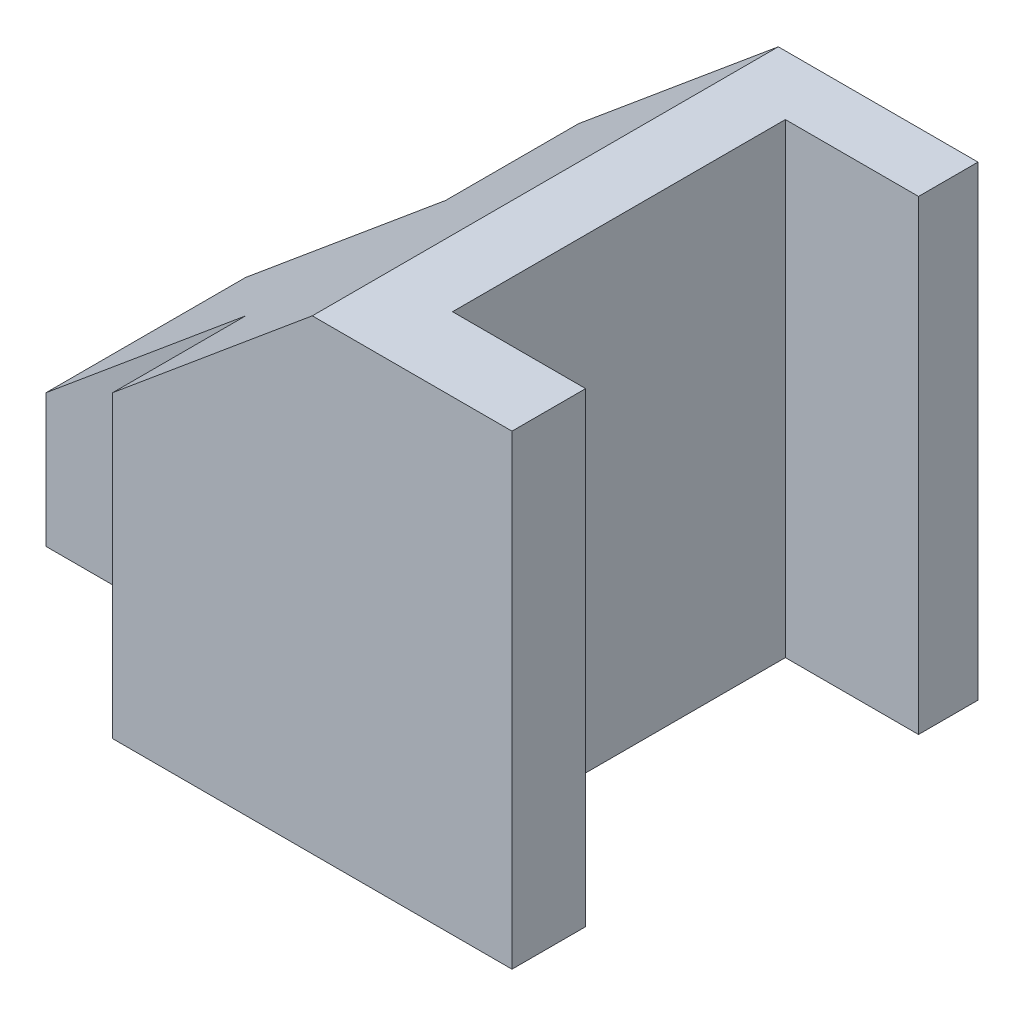
ISO-10303-21;
HEADER;
FILE_DESCRIPTION(('STEP AP214'),'2;1');
FILE_NAME('part.step','',(''),(''),'','','');
FILE_SCHEMA(('AUTOMOTIVE_DESIGN { 1 0 10303 214 1 1 1 1 }'));
ENDSEC;
DATA;
#1=APPLICATION_CONTEXT('core data for automotive mechanical design processes');
#2=APPLICATION_PROTOCOL_DEFINITION('international standard','automotive_design',2000,#1);
#3=PRODUCT_CONTEXT('',#1,'mechanical');
#4=PRODUCT('Part','Part','',(#3));
#5=PRODUCT_RELATED_PRODUCT_CATEGORY('part','',(#4));
#6=PRODUCT_DEFINITION_FORMATION('','',#4);
#7=PRODUCT_DEFINITION_CONTEXT('part definition',#1,'design');
#8=PRODUCT_DEFINITION('design','',#6,#7);
#9=PRODUCT_DEFINITION_SHAPE('','',#8);
#10=(LENGTH_UNIT() NAMED_UNIT(*) SI_UNIT(.MILLI.,.METRE.));
#11=(NAMED_UNIT(*) PLANE_ANGLE_UNIT() SI_UNIT($,.RADIAN.));
#12=(NAMED_UNIT(*) SI_UNIT($,.STERADIAN.) SOLID_ANGLE_UNIT());
#13=UNCERTAINTY_MEASURE_WITH_UNIT(LENGTH_MEASURE(1.E-05),#10,'distance_accuracy_value','');
#14=(GEOMETRIC_REPRESENTATION_CONTEXT(3) GLOBAL_UNCERTAINTY_ASSIGNED_CONTEXT((#13)) GLOBAL_UNIT_ASSIGNED_CONTEXT((#10,
#11,#12)) REPRESENTATION_CONTEXT('',''));
#15=CARTESIAN_POINT('',(0.,0.,0.));
#16=DIRECTION('',(0.,0.,1.));
#17=DIRECTION('',(1.,0.,0.));
#18=AXIS2_PLACEMENT_3D('',#15,#16,#17);
#19=CARTESIAN_POINT('',(0.,10000.,35000.));
#20=DIRECTION('',(1.,0.,0.));
#21=DIRECTION('',(0.,0.,-1.));
#22=AXIS2_PLACEMENT_3D('',#19,#20,#21);
#23=PLANE('',#22);
#24=DIRECTION('',(0.,1.,0.));
#25=VECTOR('',#24,1.);
#26=CARTESIAN_POINT('',(0.,0.,10000.));
#27=LINE('',#26,#25);
#28=CARTESIAN_POINT('',(0.,0.,10000.));
#29=VERTEX_POINT('',#28);
#30=CARTESIAN_POINT('',(0.,10000.,10000.));
#31=VERTEX_POINT('',#30);
#32=EDGE_CURVE('E131',#29,#31,#27,.T.);
#33=ORIENTED_EDGE('',*,*,#32,.F.);
#34=DIRECTION('',(0.,0.,-1.));
#35=VECTOR('',#34,1.);
#36=CARTESIAN_POINT('',(0.,0.,35000.));
#37=LINE('',#36,#35);
#38=CARTESIAN_POINT('',(0.,0.,25000.));
#39=VERTEX_POINT('',#38);
#40=EDGE_CURVE('E11',#39,#29,#37,.T.);
#41=ORIENTED_EDGE('',*,*,#40,.F.);
#42=DIRECTION('',(0.,-1.,0.));
#43=VECTOR('',#42,1.);
#44=CARTESIAN_POINT('',(0.,10000.,25000.));
#45=LINE('',#44,#43);
#46=CARTESIAN_POINT('',(0.,10000.,25000.));
#47=VERTEX_POINT('',#46);
#48=EDGE_CURVE('E154',#47,#39,#45,.T.);
#49=ORIENTED_EDGE('',*,*,#48,.F.);
#50=DIRECTION('',(0.,0.,-1.));
#51=VECTOR('',#50,1.);
#52=CARTESIAN_POINT('',(0.,10000.,35000.));
#53=LINE('',#52,#51);
#54=EDGE_CURVE('E143',#47,#31,#53,.T.);
#55=ORIENTED_EDGE('',*,*,#54,.T.);
#56=EDGE_LOOP('',(#33,#41,#49,#55));
#57=FACE_BOUND('',#56,.T.);
#58=ADVANCED_FACE('F33',(#57),#23,.F.);
#59=CARTESIAN_POINT('',(45000.,0.,35000.));
#60=DIRECTION('',(-1.,0.,0.));
#61=DIRECTION('',(0.,0.,1.));
#62=AXIS2_PLACEMENT_3D('',#59,#60,#61);
#63=PLANE('',#62);
#64=DIRECTION('',(0.,0.,-1.));
#65=VECTOR('',#64,1.);
#66=CARTESIAN_POINT('',(45000.,0.,35000.));
#67=LINE('',#66,#65);
#68=CARTESIAN_POINT('',(45000.,0.,35000.));
#69=VERTEX_POINT('',#68);
#70=CARTESIAN_POINT('',(45000.,0.,29467.0152855992));
#71=VERTEX_POINT('',#70);
#72=EDGE_CURVE('E40',#69,#71,#67,.T.);
#73=ORIENTED_EDGE('',*,*,#72,.T.);
#74=DIRECTION('',(0.,1.,0.));
#75=VECTOR('',#74,1.);
#76=CARTESIAN_POINT('',(45000.,0.,29467.0152855992));
#77=LINE('',#76,#75);
#78=CARTESIAN_POINT('',(45000.,35000.,29467.0152855992));
#79=VERTEX_POINT('',#78);
#80=EDGE_CURVE('E187',#71,#79,#77,.T.);
#81=ORIENTED_EDGE('',*,*,#80,.T.);
#82=DIRECTION('',(0.,0.,-1.));
#83=VECTOR('',#82,1.);
#84=CARTESIAN_POINT('',(45000.,35000.,35000.));
#85=LINE('',#84,#83);
#86=CARTESIAN_POINT('',(45000.,35000.,35000.));
#87=VERTEX_POINT('',#86);
#88=EDGE_CURVE('E219',#87,#79,#85,.T.);
#89=ORIENTED_EDGE('',*,*,#88,.F.);
#90=DIRECTION('',(0.,1.,0.));
#91=VECTOR('',#90,1.);
#92=CARTESIAN_POINT('',(45000.,0.,35000.));
#93=LINE('',#92,#91);
#94=EDGE_CURVE('E198',#69,#87,#93,.T.);
#95=ORIENTED_EDGE('',*,*,#94,.F.);
#96=EDGE_LOOP('',(#73,#81,#89,#95));
#97=FACE_BOUND('',#96,.T.);
#98=ADVANCED_FACE('F252',(#97),#63,.F.);
#99=CARTESIAN_POINT('',(0.,0.,35000.));
#100=DIRECTION('',(0.,1.,0.));
#101=DIRECTION('',(0.,0.,1.));
#102=AXIS2_PLACEMENT_3D('',#99,#100,#101);
#103=PLANE('',#102);
#104=DIRECTION('',(-1.,0.,0.));
#105=VECTOR('',#104,1.);
#106=CARTESIAN_POINT('',(15000.,0.,10000.));
#107=LINE('',#106,#105);
#108=CARTESIAN_POINT('',(15000.,0.,10000.));
#109=VERTEX_POINT('',#108);
#110=EDGE_CURVE('E128',#109,#29,#107,.T.);
#111=ORIENTED_EDGE('',*,*,#110,.F.);
#112=DIRECTION('',(0.,0.,-1.));
#113=VECTOR('',#112,1.);
#114=CARTESIAN_POINT('',(15000.,0.,10000.));
#115=LINE('',#114,#113);
#116=CARTESIAN_POINT('',(15000.,0.,0.));
#117=VERTEX_POINT('',#116);
#118=EDGE_CURVE('E164',#109,#117,#115,.T.);
#119=ORIENTED_EDGE('',*,*,#118,.T.);
#120=DIRECTION('',(1.,0.,0.));
#121=VECTOR('',#120,1.);
#122=CARTESIAN_POINT('',(0.,0.,0.));
#123=LINE('',#122,#121);
#124=CARTESIAN_POINT('',(45000.,0.,0.));
#125=VERTEX_POINT('',#124);
#126=EDGE_CURVE('E190',#117,#125,#123,.T.);
#127=ORIENTED_EDGE('',*,*,#126,.T.);
#128=CARTESIAN_POINT('',(45000.,0.,4467.01528559923));
#129=VERTEX_POINT('',#128);
#130=EDGE_CURVE('E221',#129,#125,#67,.T.);
#131=ORIENTED_EDGE('',*,*,#130,.F.);
#132=DIRECTION('',(-1.,0.,0.));
#133=VECTOR('',#132,1.);
#134=CARTESIAN_POINT('',(45000.,0.,4467.01528559923));
#135=LINE('',#134,#133);
#136=CARTESIAN_POINT('',(35000.,0.,4467.01528559924));
#137=VERTEX_POINT('',#136);
#138=EDGE_CURVE('E170',#129,#137,#135,.T.);
#139=ORIENTED_EDGE('',*,*,#138,.T.);
#140=DIRECTION('',(0.,0.,1.));
#141=VECTOR('',#140,1.);
#142=CARTESIAN_POINT('',(35000.,0.,4467.01528559924));
#143=LINE('',#142,#141);
#144=CARTESIAN_POINT('',(35000.,0.,29467.0152855992));
#145=VERTEX_POINT('',#144);
#146=EDGE_CURVE('E173',#137,#145,#143,.T.);
#147=ORIENTED_EDGE('',*,*,#146,.T.);
#148=DIRECTION('',(1.,0.,0.));
#149=VECTOR('',#148,1.);
#150=CARTESIAN_POINT('',(45000.,0.,29467.0152855992));
#151=LINE('',#150,#149);
#152=EDGE_CURVE('E177',#145,#71,#151,.T.);
#153=ORIENTED_EDGE('',*,*,#152,.T.);
#154=ORIENTED_EDGE('',*,*,#72,.F.);
#155=DIRECTION('',(1.,0.,0.));
#156=VECTOR('',#155,1.);
#157=CARTESIAN_POINT('',(0.,0.,35000.));
#158=LINE('',#157,#156);
#159=CARTESIAN_POINT('',(15000.,0.,35000.));
#160=VERTEX_POINT('',#159);
#161=EDGE_CURVE('E196',#160,#69,#158,.T.);
#162=ORIENTED_EDGE('',*,*,#161,.F.);
#163=DIRECTION('',(0.,0.,1.));
#164=VECTOR('',#163,1.);
#165=CARTESIAN_POINT('',(15000.,0.,25000.));
#166=LINE('',#165,#164);
#167=CARTESIAN_POINT('',(15000.,0.,25000.));
#168=VERTEX_POINT('',#167);
#169=EDGE_CURVE('E55',#168,#160,#166,.T.);
#170=ORIENTED_EDGE('',*,*,#169,.F.);
#171=DIRECTION('',(1.,0.,0.));
#172=VECTOR('',#171,1.);
#173=CARTESIAN_POINT('',(0.,0.,25000.));
#174=LINE('',#173,#172);
#175=EDGE_CURVE('E149',#39,#168,#174,.T.);
#176=ORIENTED_EDGE('',*,*,#175,.F.);
#177=ORIENTED_EDGE('',*,*,#40,.T.);
#178=EDGE_LOOP('',(#111,#119,#127,#131,#139,#147,#153,#154,#162,#170,#176,#177));
#179=FACE_BOUND('',#178,.T.);
#180=ADVANCED_FACE('F147',(#179),#103,.F.);
#181=CARTESIAN_POINT('',(45000.,35000.,4467.01528559923));
#182=VERTEX_POINT('',#181);
#183=CARTESIAN_POINT('',(45000.,35000.,0.));
#184=VERTEX_POINT('',#183);
#185=EDGE_CURVE('E218',#182,#184,#85,.T.);
#186=ORIENTED_EDGE('',*,*,#185,.F.);
#187=DIRECTION('',(0.,1.,0.));
#188=VECTOR('',#187,1.);
#189=CARTESIAN_POINT('',(45000.,0.,4467.01528559923));
#190=LINE('',#189,#188);
#191=EDGE_CURVE('E180',#129,#182,#190,.T.);
#192=ORIENTED_EDGE('',*,*,#191,.F.);
#193=ORIENTED_EDGE('',*,*,#130,.T.);
#194=DIRECTION('',(0.,1.,0.));
#195=VECTOR('',#194,1.);
#196=CARTESIAN_POINT('',(45000.,0.,0.));
#197=LINE('',#196,#195);
#198=EDGE_CURVE('E207',#125,#184,#197,.T.);
#199=ORIENTED_EDGE('',*,*,#198,.T.);
#200=EDGE_LOOP('',(#186,#192,#193,#199));
#201=FACE_BOUND('',#200,.T.);
#202=ADVANCED_FACE('F232',(#201),#63,.F.);
#203=CARTESIAN_POINT('',(45000.,35000.,35000.));
#204=DIRECTION('',(0.,-1.,0.));
#205=DIRECTION('',(0.,0.,-1.));
#206=AXIS2_PLACEMENT_3D('',#203,#204,#205);
#207=PLANE('',#206);
#208=ORIENTED_EDGE('',*,*,#88,.T.);
#209=DIRECTION('',(1.,0.,0.));
#210=VECTOR('',#209,1.);
#211=CARTESIAN_POINT('',(45000.,35000.,29467.0152855992));
#212=LINE('',#211,#210);
#213=CARTESIAN_POINT('',(35000.,35000.,29467.0152855992));
#214=VERTEX_POINT('',#213);
#215=EDGE_CURVE('E174',#214,#79,#212,.T.);
#216=ORIENTED_EDGE('',*,*,#215,.F.);
#217=DIRECTION('',(0.,0.,1.));
#218=VECTOR('',#217,1.);
#219=CARTESIAN_POINT('',(35000.,35000.,4467.01528559924));
#220=LINE('',#219,#218);
#221=CARTESIAN_POINT('',(35000.,35000.,4467.01528559924));
#222=VERTEX_POINT('',#221);
#223=EDGE_CURVE('E183',#222,#214,#220,.T.);
#224=ORIENTED_EDGE('',*,*,#223,.F.);
#225=DIRECTION('',(-1.,0.,0.));
#226=VECTOR('',#225,1.);
#227=CARTESIAN_POINT('',(45000.,35000.,4467.01528559923));
#228=LINE('',#227,#226);
#229=EDGE_CURVE('E168',#182,#222,#228,.T.);
#230=ORIENTED_EDGE('',*,*,#229,.F.);
#231=ORIENTED_EDGE('',*,*,#185,.T.);
#232=DIRECTION('',(-1.,0.,0.));
#233=VECTOR('',#232,1.);
#234=CARTESIAN_POINT('',(45000.,35000.,0.));
#235=LINE('',#234,#233);
#236=CARTESIAN_POINT('',(30000.,35000.,0.));
#237=VERTEX_POINT('',#236);
#238=EDGE_CURVE('E210',#184,#237,#235,.T.);
#239=ORIENTED_EDGE('',*,*,#238,.T.);
#240=DIRECTION('',(0.,0.,-1.));
#241=VECTOR('',#240,1.);
#242=CARTESIAN_POINT('',(30000.,35000.,35000.));
#243=LINE('',#242,#241);
#244=CARTESIAN_POINT('',(30000.,35000.,35000.));
#245=VERTEX_POINT('',#244);
#246=EDGE_CURVE('E215',#245,#237,#243,.T.);
#247=ORIENTED_EDGE('',*,*,#246,.F.);
#248=DIRECTION('',(-1.,0.,0.));
#249=VECTOR('',#248,1.);
#250=CARTESIAN_POINT('',(45000.,35000.,35000.));
#251=LINE('',#250,#249);
#252=EDGE_CURVE('E201',#87,#245,#251,.T.);
#253=ORIENTED_EDGE('',*,*,#252,.F.);
#254=EDGE_LOOP('',(#208,#216,#224,#230,#231,#239,#247,#253));
#255=FACE_BOUND('',#254,.T.);
#256=ADVANCED_FACE('F240',(#255),#207,.F.);
#257=CARTESIAN_POINT('',(30000.,35000.,35000.));
#258=DIRECTION('',(0.64018439966448,-0.768221279597376,0.));
#259=DIRECTION('',(0.768221279597376,0.64018439966448,0.));
#260=AXIS2_PLACEMENT_3D('',#257,#258,#259);
#261=PLANE('',#260);
#262=DIRECTION('',(-0.768221279597376,-0.64018439966448,0.));
#263=VECTOR('',#262,1.);
#264=CARTESIAN_POINT('',(30000.,35000.,0.));
#265=LINE('',#264,#263);
#266=CARTESIAN_POINT('',(15000.,22500.,0.));
#267=VERTEX_POINT('',#266);
#268=EDGE_CURVE('E199',#237,#267,#265,.T.);
#269=ORIENTED_EDGE('',*,*,#268,.T.);
#270=DIRECTION('',(0.,0.,-1.));
#271=VECTOR('',#270,1.);
#272=CARTESIAN_POINT('',(15000.,22500.,10000.));
#273=LINE('',#272,#271);
#274=CARTESIAN_POINT('',(15000.,22500.,10000.));
#275=VERTEX_POINT('',#274);
#276=EDGE_CURVE('E47',#275,#267,#273,.T.);
#277=ORIENTED_EDGE('',*,*,#276,.F.);
#278=DIRECTION('',(0.768221279597376,0.64018439966448,0.));
#279=VECTOR('',#278,1.);
#280=CARTESIAN_POINT('',(0.,10000.,10000.));
#281=LINE('',#280,#279);
#282=EDGE_CURVE('E144',#31,#275,#281,.T.);
#283=ORIENTED_EDGE('',*,*,#282,.F.);
#284=ORIENTED_EDGE('',*,*,#54,.F.);
#285=DIRECTION('',(-0.768221279597376,-0.64018439966448,0.));
#286=VECTOR('',#285,1.);
#287=CARTESIAN_POINT('',(15000.,22500.,25000.));
#288=LINE('',#287,#286);
#289=CARTESIAN_POINT('',(15000.,22500.,25000.));
#290=VERTEX_POINT('',#289);
#291=EDGE_CURVE('E156',#290,#47,#288,.T.);
#292=ORIENTED_EDGE('',*,*,#291,.F.);
#293=DIRECTION('',(0.,0.,1.));
#294=VECTOR('',#293,1.);
#295=CARTESIAN_POINT('',(15000.,22500.,25000.));
#296=LINE('',#295,#294);
#297=CARTESIAN_POINT('',(15000.,22500.,35000.));
#298=VERTEX_POINT('',#297);
#299=EDGE_CURVE('E165',#290,#298,#296,.T.);
#300=ORIENTED_EDGE('',*,*,#299,.T.);
#301=DIRECTION('',(-0.768221279597376,-0.64018439966448,0.));
#302=VECTOR('',#301,1.);
#303=CARTESIAN_POINT('',(30000.,35000.,35000.));
#304=LINE('',#303,#302);
#305=EDGE_CURVE('E203',#245,#298,#304,.T.);
#306=ORIENTED_EDGE('',*,*,#305,.F.);
#307=ORIENTED_EDGE('',*,*,#246,.T.);
#308=EDGE_LOOP('',(#269,#277,#283,#284,#292,#300,#306,#307));
#309=FACE_BOUND('',#308,.T.);
#310=ADVANCED_FACE('F245',(#309),#261,.F.);
#311=CARTESIAN_POINT('',(0.,0.,35000.));
#312=DIRECTION('',(0.,0.,1.));
#313=DIRECTION('',(1.,0.,0.));
#314=AXIS2_PLACEMENT_3D('',#311,#312,#313);
#315=PLANE('',#314);
#316=DIRECTION('',(0.,1.,0.));
#317=VECTOR('',#316,1.);
#318=CARTESIAN_POINT('',(15000.,0.,35000.));
#319=LINE('',#318,#317);
#320=EDGE_CURVE('E158',#160,#298,#319,.T.);
#321=ORIENTED_EDGE('',*,*,#320,.F.);
#322=ORIENTED_EDGE('',*,*,#161,.T.);
#323=ORIENTED_EDGE('',*,*,#94,.T.);
#324=ORIENTED_EDGE('',*,*,#252,.T.);
#325=ORIENTED_EDGE('',*,*,#305,.T.);
#326=EDGE_LOOP('',(#321,#322,#323,#324,#325));
#327=FACE_BOUND('',#326,.T.);
#328=ADVANCED_FACE('F248',(#327),#315,.T.);
#329=CARTESIAN_POINT('',(0.,0.,0.));
#330=DIRECTION('',(0.,0.,1.));
#331=DIRECTION('',(1.,0.,0.));
#332=AXIS2_PLACEMENT_3D('',#329,#330,#331);
#333=PLANE('',#332);
#334=ORIENTED_EDGE('',*,*,#126,.F.);
#335=DIRECTION('',(0.,-1.,0.));
#336=VECTOR('',#335,1.);
#337=CARTESIAN_POINT('',(15000.,22500.,0.));
#338=LINE('',#337,#336);
#339=EDGE_CURVE('E136',#267,#117,#338,.T.);
#340=ORIENTED_EDGE('',*,*,#339,.F.);
#341=ORIENTED_EDGE('',*,*,#268,.F.);
#342=ORIENTED_EDGE('',*,*,#238,.F.);
#343=ORIENTED_EDGE('',*,*,#198,.F.);
#344=EDGE_LOOP('',(#334,#340,#341,#342,#343));
#345=FACE_BOUND('',#344,.T.);
#346=ADVANCED_FACE('F236',(#345),#333,.F.);
#347=CARTESIAN_POINT('',(45000.,0.,29467.0152855992));
#348=DIRECTION('',(0.,0.,1.));
#349=DIRECTION('',(1.,0.,0.));
#350=AXIS2_PLACEMENT_3D('',#347,#348,#349);
#351=PLANE('',#350);
#352=ORIENTED_EDGE('',*,*,#215,.T.);
#353=ORIENTED_EDGE('',*,*,#80,.F.);
#354=ORIENTED_EDGE('',*,*,#152,.F.);
#355=DIRECTION('',(0.,1.,0.));
#356=VECTOR('',#355,1.);
#357=CARTESIAN_POINT('',(35000.,0.,29467.0152855992));
#358=LINE('',#357,#356);
#359=EDGE_CURVE('E191',#145,#214,#358,.T.);
#360=ORIENTED_EDGE('',*,*,#359,.T.);
#361=EDGE_LOOP('',(#352,#353,#354,#360));
#362=FACE_BOUND('',#361,.T.);
#363=ADVANCED_FACE('F255',(#362),#351,.F.);
#364=CARTESIAN_POINT('',(35000.,0.,4467.01528559924));
#365=DIRECTION('',(-1.,0.,0.));
#366=DIRECTION('',(0.,0.,1.));
#367=AXIS2_PLACEMENT_3D('',#364,#365,#366);
#368=PLANE('',#367);
#369=ORIENTED_EDGE('',*,*,#223,.T.);
#370=ORIENTED_EDGE('',*,*,#359,.F.);
#371=ORIENTED_EDGE('',*,*,#146,.F.);
#372=DIRECTION('',(0.,1.,0.));
#373=VECTOR('',#372,1.);
#374=CARTESIAN_POINT('',(35000.,0.,4467.01528559924));
#375=LINE('',#374,#373);
#376=EDGE_CURVE('E193',#137,#222,#375,.T.);
#377=ORIENTED_EDGE('',*,*,#376,.T.);
#378=EDGE_LOOP('',(#369,#370,#371,#377));
#379=FACE_BOUND('',#378,.T.);
#380=ADVANCED_FACE('F258',(#379),#368,.F.);
#381=CARTESIAN_POINT('',(45000.,0.,4467.01528559923));
#382=DIRECTION('',(0.,0.,-1.));
#383=DIRECTION('',(-1.,0.,0.));
#384=AXIS2_PLACEMENT_3D('',#381,#382,#383);
#385=PLANE('',#384);
#386=ORIENTED_EDGE('',*,*,#229,.T.);
#387=ORIENTED_EDGE('',*,*,#376,.F.);
#388=ORIENTED_EDGE('',*,*,#138,.F.);
#389=ORIENTED_EDGE('',*,*,#191,.T.);
#390=EDGE_LOOP('',(#386,#387,#388,#389));
#391=FACE_BOUND('',#390,.T.);
#392=ADVANCED_FACE('F260',(#391),#385,.F.);
#393=CARTESIAN_POINT('',(15000.,0.,25000.));
#394=DIRECTION('',(1.,0.,0.));
#395=DIRECTION('',(0.,0.,-1.));
#396=AXIS2_PLACEMENT_3D('',#393,#394,#395);
#397=PLANE('',#396);
#398=ORIENTED_EDGE('',*,*,#320,.T.);
#399=ORIENTED_EDGE('',*,*,#299,.F.);
#400=DIRECTION('',(0.,1.,0.));
#401=VECTOR('',#400,1.);
#402=CARTESIAN_POINT('',(15000.,0.,25000.));
#403=LINE('',#402,#401);
#404=EDGE_CURVE('E153',#168,#290,#403,.T.);
#405=ORIENTED_EDGE('',*,*,#404,.F.);
#406=ORIENTED_EDGE('',*,*,#169,.T.);
#407=EDGE_LOOP('',(#398,#399,#405,#406));
#408=FACE_BOUND('',#407,.T.);
#409=ADVANCED_FACE('F262',(#408),#397,.F.);
#410=CARTESIAN_POINT('',(0.,0.,25000.));
#411=DIRECTION('',(0.,0.,1.));
#412=DIRECTION('',(1.,0.,0.));
#413=AXIS2_PLACEMENT_3D('',#410,#411,#412);
#414=PLANE('',#413);
#415=ORIENTED_EDGE('',*,*,#48,.T.);
#416=ORIENTED_EDGE('',*,*,#175,.T.);
#417=ORIENTED_EDGE('',*,*,#404,.T.);
#418=ORIENTED_EDGE('',*,*,#291,.T.);
#419=EDGE_LOOP('',(#415,#416,#417,#418));
#420=FACE_BOUND('',#419,.T.);
#421=ADVANCED_FACE('F268',(#420),#414,.T.);
#422=CARTESIAN_POINT('',(15000.,22500.,10000.));
#423=DIRECTION('',(1.,0.,0.));
#424=DIRECTION('',(0.,0.,-1.));
#425=AXIS2_PLACEMENT_3D('',#422,#423,#424);
#426=PLANE('',#425);
#427=ORIENTED_EDGE('',*,*,#339,.T.);
#428=ORIENTED_EDGE('',*,*,#118,.F.);
#429=DIRECTION('',(0.,-1.,0.));
#430=VECTOR('',#429,1.);
#431=CARTESIAN_POINT('',(15000.,22500.,10000.));
#432=LINE('',#431,#430);
#433=EDGE_CURVE('E133',#275,#109,#432,.T.);
#434=ORIENTED_EDGE('',*,*,#433,.F.);
#435=ORIENTED_EDGE('',*,*,#276,.T.);
#436=EDGE_LOOP('',(#427,#428,#434,#435));
#437=FACE_BOUND('',#436,.T.);
#438=ADVANCED_FACE('F330',(#437),#426,.F.);
#439=CARTESIAN_POINT('',(0.,0.,10000.));
#440=DIRECTION('',(0.,0.,-1.));
#441=DIRECTION('',(-1.,0.,0.));
#442=AXIS2_PLACEMENT_3D('',#439,#440,#441);
#443=PLANE('',#442);
#444=ORIENTED_EDGE('',*,*,#110,.T.);
#445=ORIENTED_EDGE('',*,*,#32,.T.);
#446=ORIENTED_EDGE('',*,*,#282,.T.);
#447=ORIENTED_EDGE('',*,*,#433,.T.);
#448=EDGE_LOOP('',(#444,#445,#446,#447));
#449=FACE_BOUND('',#448,.T.);
#450=ADVANCED_FACE('F130',(#449),#443,.T.);
#451=CLOSED_SHELL('',(#58,#98,#180,#202,#256,#310,#328,#346,#363,#380,#392,#409,#421,#438,#450));
#452=MANIFOLD_SOLID_BREP('B2',#451);
#453=ADVANCED_BREP_SHAPE_REPRESENTATION('',(#18,#452),#14);
#454=SHAPE_DEFINITION_REPRESENTATION(#9,#453);
ENDSEC;
END-ISO-10303-21;
